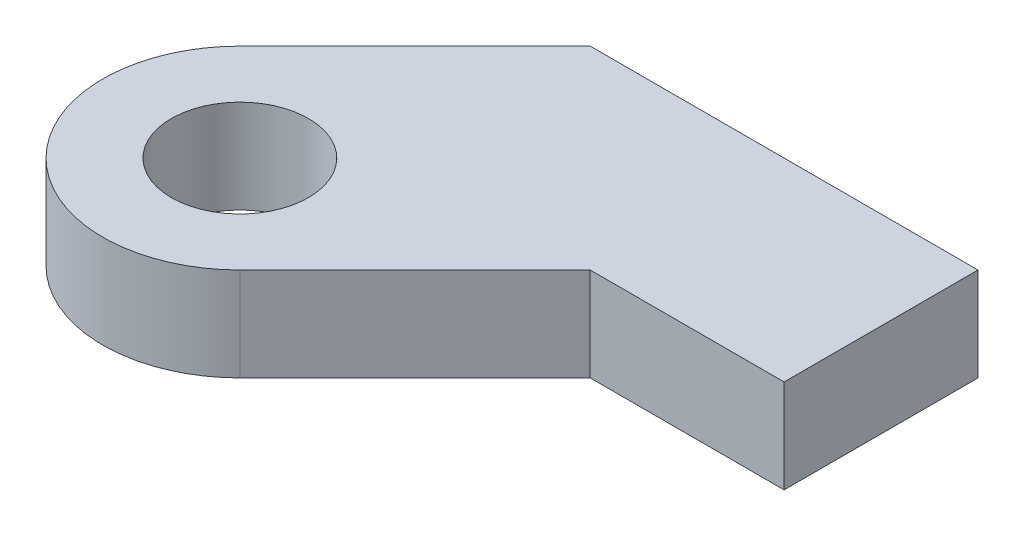
ISO-10303-21;
HEADER;
FILE_DESCRIPTION(('STEP AP214'),'2;1');
FILE_NAME('part.step','',(''),(''),'','','');
FILE_SCHEMA(('AUTOMOTIVE_DESIGN { 1 0 10303 214 1 1 1 1 }'));
ENDSEC;
DATA;
#1=APPLICATION_CONTEXT('core data for automotive mechanical design processes');
#2=APPLICATION_PROTOCOL_DEFINITION('international standard','automotive_design',2000,#1);
#3=PRODUCT_CONTEXT('',#1,'mechanical');
#4=PRODUCT('Part','Part','',(#3));
#5=PRODUCT_RELATED_PRODUCT_CATEGORY('part','',(#4));
#6=PRODUCT_DEFINITION_FORMATION('','',#4);
#7=PRODUCT_DEFINITION_CONTEXT('part definition',#1,'design');
#8=PRODUCT_DEFINITION('design','',#6,#7);
#9=PRODUCT_DEFINITION_SHAPE('','',#8);
#10=(LENGTH_UNIT() NAMED_UNIT(*) SI_UNIT(.MILLI.,.METRE.));
#11=(NAMED_UNIT(*) PLANE_ANGLE_UNIT() SI_UNIT($,.RADIAN.));
#12=(NAMED_UNIT(*) SI_UNIT($,.STERADIAN.) SOLID_ANGLE_UNIT());
#13=UNCERTAINTY_MEASURE_WITH_UNIT(LENGTH_MEASURE(1.E-05),#10,'distance_accuracy_value','');
#14=(GEOMETRIC_REPRESENTATION_CONTEXT(3) GLOBAL_UNCERTAINTY_ASSIGNED_CONTEXT((#13)) GLOBAL_UNIT_ASSIGNED_CONTEXT((#10,
#11,#12)) REPRESENTATION_CONTEXT('',''));
#15=CARTESIAN_POINT('',(0.,0.,0.));
#16=DIRECTION('',(0.,0.,1.));
#17=DIRECTION('',(1.,0.,0.));
#18=AXIS2_PLACEMENT_3D('',#15,#16,#17);
#19=CARTESIAN_POINT('',(-2.82842712474619,1.5,2.82842712474619));
#20=DIRECTION('',(0.,1.,0.));
#21=DIRECTION('',(0.,0.,1.));
#22=AXIS2_PLACEMENT_3D('',#19,#20,#21);
#23=PLANE('',#22);
#24=DIRECTION('',(-1.,0.,0.));
#25=VECTOR('',#24,1.);
#26=CARTESIAN_POINT('',(1.53795724908074,1.5,-1.53795724908074));
#27=LINE('',#26,#25);
#28=CARTESIAN_POINT('',(4.64922708630155,1.5,-1.53795724908074));
#29=VERTEX_POINT('',#28);
#30=CARTESIAN_POINT('',(-1.57331258814007,1.5,-1.53795724908074));
#31=VERTEX_POINT('',#30);
#32=EDGE_CURVE('E51',#29,#31,#27,.T.);
#33=ORIENTED_EDGE('',*,*,#32,.T.);
#34=DIRECTION('',(-0.707106781186547,0.,0.707106781186548));
#35=VECTOR('',#34,1.);
#36=CARTESIAN_POINT('',(-1.57331258814007,1.5,-1.53795724908074));
#37=LINE('',#36,#35);
#38=CARTESIAN_POINT('',(-4.38406204335659,1.5,1.27279220613579));
#39=VERTEX_POINT('',#38);
#40=EDGE_CURVE('E89',#31,#39,#37,.T.);
#41=ORIENTED_EDGE('',*,*,#40,.T.);
#42=CARTESIAN_POINT('',(-2.82842712474619,1.5,2.82842712474619));
#43=DIRECTION('',(0.,1.,0.));
#44=DIRECTION('',(0.,0.,1.));
#45=AXIS2_PLACEMENT_3D('',#42,#43,#44);
#46=CIRCLE('',#45,2.2);
#47=CARTESIAN_POINT('',(-1.27279220613578,1.5,4.3840620433566));
#48=VERTEX_POINT('',#47);
#49=EDGE_CURVE('E103',#39,#48,#46,.T.);
#50=ORIENTED_EDGE('',*,*,#49,.T.);
#51=DIRECTION('',(0.707106781186547,0.,-0.707106781186548));
#52=VECTOR('',#51,1.);
#53=CARTESIAN_POINT('',(1.53795724908074,1.5,1.57331258814007));
#54=LINE('',#53,#52);
#55=CARTESIAN_POINT('',(1.53795724908074,1.5,1.57331258814007));
#56=VERTEX_POINT('',#55);
#57=EDGE_CURVE('E97',#48,#56,#54,.T.);
#58=ORIENTED_EDGE('',*,*,#57,.T.);
#59=DIRECTION('',(1.,0.,0.));
#60=VECTOR('',#59,1.);
#61=CARTESIAN_POINT('',(1.53795724908074,1.5,1.57331258814007));
#62=LINE('',#61,#60);
#63=CARTESIAN_POINT('',(4.64922708630155,1.5,1.57331258814007));
#64=VERTEX_POINT('',#63);
#65=EDGE_CURVE('E101',#56,#64,#62,.T.);
#66=ORIENTED_EDGE('',*,*,#65,.T.);
#67=DIRECTION('',(0.,0.,-1.));
#68=VECTOR('',#67,1.);
#69=CARTESIAN_POINT('',(4.64922708630155,1.5,-1.53795724908074));
#70=LINE('',#69,#68);
#71=EDGE_CURVE('E117',#64,#29,#70,.T.);
#72=ORIENTED_EDGE('',*,*,#71,.T.);
#73=EDGE_LOOP('',(#33,#41,#50,#58,#66,#72));
#74=FACE_BOUND('',#73,.T.);
#75=CARTESIAN_POINT('',(-2.82842712474619,1.5,2.82842712474619));
#76=DIRECTION('',(0.,1.,0.));
#77=DIRECTION('',(0.,0.,1.));
#78=AXIS2_PLACEMENT_3D('',#75,#76,#77);
#79=CIRCLE('',#78,1.1);
#80=CARTESIAN_POINT('',(-2.82842712474619,1.5,3.92842712474619));
#81=VERTEX_POINT('',#80);
#82=EDGE_CURVE('E126',#81,#81,#79,.T.);
#83=ORIENTED_EDGE('',*,*,#82,.F.);
#84=EDGE_LOOP('',(#83));
#85=FACE_BOUND('',#84,.T.);
#86=ADVANCED_FACE('F34',(#74,#85),#23,.T.);
#87=CARTESIAN_POINT('',(-2.82842712474619,0.,2.82842712474619));
#88=DIRECTION('',(0.,1.,0.));
#89=DIRECTION('',(0.,0.,1.));
#90=AXIS2_PLACEMENT_3D('',#87,#88,#89);
#91=PLANE('',#90);
#92=DIRECTION('',(-0.707106781186547,0.,0.707106781186548));
#93=VECTOR('',#92,1.);
#94=CARTESIAN_POINT('',(-1.57331258814007,0.,-1.53795724908074));
#95=LINE('',#94,#93);
#96=CARTESIAN_POINT('',(-1.57331258814007,0.,-1.53795724908074));
#97=VERTEX_POINT('',#96);
#98=CARTESIAN_POINT('',(-4.38406204335659,0.,1.27279220613579));
#99=VERTEX_POINT('',#98);
#100=EDGE_CURVE('E123',#97,#99,#95,.T.);
#101=ORIENTED_EDGE('',*,*,#100,.F.);
#102=DIRECTION('',(-1.,0.,0.));
#103=VECTOR('',#102,1.);
#104=CARTESIAN_POINT('',(1.53795724908074,0.,-1.53795724908074));
#105=LINE('',#104,#103);
#106=CARTESIAN_POINT('',(4.64922708630155,0.,-1.53795724908074));
#107=VERTEX_POINT('',#106);
#108=EDGE_CURVE('E131',#107,#97,#105,.T.);
#109=ORIENTED_EDGE('',*,*,#108,.F.);
#110=DIRECTION('',(0.,0.,-1.));
#111=VECTOR('',#110,1.);
#112=CARTESIAN_POINT('',(4.64922708630155,0.,-1.53795724908074));
#113=LINE('',#112,#111);
#114=CARTESIAN_POINT('',(4.64922708630155,0.,1.57331258814007));
#115=VERTEX_POINT('',#114);
#116=EDGE_CURVE('E82',#115,#107,#113,.T.);
#117=ORIENTED_EDGE('',*,*,#116,.F.);
#118=DIRECTION('',(1.,0.,0.));
#119=VECTOR('',#118,1.);
#120=CARTESIAN_POINT('',(1.53795724908074,0.,1.57331258814007));
#121=LINE('',#120,#119);
#122=CARTESIAN_POINT('',(1.53795724908074,0.,1.57331258814007));
#123=VERTEX_POINT('',#122);
#124=EDGE_CURVE('E75',#123,#115,#121,.T.);
#125=ORIENTED_EDGE('',*,*,#124,.F.);
#126=DIRECTION('',(0.707106781186547,0.,-0.707106781186548));
#127=VECTOR('',#126,1.);
#128=CARTESIAN_POINT('',(1.53795724908074,0.,1.57331258814007));
#129=LINE('',#128,#127);
#130=CARTESIAN_POINT('',(-1.27279220613578,0.,4.3840620433566));
#131=VERTEX_POINT('',#130);
#132=EDGE_CURVE('E111',#131,#123,#129,.T.);
#133=ORIENTED_EDGE('',*,*,#132,.F.);
#134=CARTESIAN_POINT('',(-2.82842712474619,0.,2.82842712474619));
#135=DIRECTION('',(0.,1.,0.));
#136=DIRECTION('',(0.,0.,1.));
#137=AXIS2_PLACEMENT_3D('',#134,#135,#136);
#138=CIRCLE('',#137,2.2);
#139=EDGE_CURVE('E125',#99,#131,#138,.T.);
#140=ORIENTED_EDGE('',*,*,#139,.F.);
#141=EDGE_LOOP('',(#101,#109,#117,#125,#133,#140));
#142=FACE_BOUND('',#141,.T.);
#143=CARTESIAN_POINT('',(-2.82842712474619,0.,2.82842712474619));
#144=DIRECTION('',(0.,1.,0.));
#145=DIRECTION('',(0.,0.,1.));
#146=AXIS2_PLACEMENT_3D('',#143,#144,#145);
#147=CIRCLE('',#146,1.1);
#148=CARTESIAN_POINT('',(-2.82842712474619,0.,3.92842712474619));
#149=VERTEX_POINT('',#148);
#150=EDGE_CURVE('E149',#149,#149,#147,.T.);
#151=ORIENTED_EDGE('',*,*,#150,.T.);
#152=EDGE_LOOP('',(#151));
#153=FACE_BOUND('',#152,.T.);
#154=ADVANCED_FACE('F141',(#142,#153),#91,.F.);
#155=CARTESIAN_POINT('',(-1.57331258814007,1.5,-1.53795724908074));
#156=DIRECTION('',(0.707106781186548,0.,0.707106781186547));
#157=DIRECTION('',(0.707106781186547,0.,-0.707106781186548));
#158=AXIS2_PLACEMENT_3D('',#155,#156,#157);
#159=PLANE('',#158);
#160=ORIENTED_EDGE('',*,*,#100,.T.);
#161=DIRECTION('',(0.,-1.,0.));
#162=VECTOR('',#161,1.);
#163=CARTESIAN_POINT('',(-4.38406204335659,1.5,1.27279220613579));
#164=LINE('',#163,#162);
#165=EDGE_CURVE('E43',#39,#99,#164,.T.);
#166=ORIENTED_EDGE('',*,*,#165,.F.);
#167=ORIENTED_EDGE('',*,*,#40,.F.);
#168=DIRECTION('',(0.,-1.,0.));
#169=VECTOR('',#168,1.);
#170=CARTESIAN_POINT('',(-1.57331258814007,1.5,-1.53795724908074));
#171=LINE('',#170,#169);
#172=EDGE_CURVE('E11',#31,#97,#171,.T.);
#173=ORIENTED_EDGE('',*,*,#172,.T.);
#174=EDGE_LOOP('',(#160,#166,#167,#173));
#175=FACE_BOUND('',#174,.T.);
#176=ADVANCED_FACE('F36',(#175),#159,.F.);
#177=CARTESIAN_POINT('',(-2.82842712474619,1.5,2.82842712474619));
#178=DIRECTION('',(0.,-1.,0.));
#179=DIRECTION('',(0.,0.,-1.));
#180=AXIS2_PLACEMENT_3D('',#177,#178,#179);
#181=CYLINDRICAL_SURFACE('',#180,2.2);
#182=ORIENTED_EDGE('',*,*,#139,.T.);
#183=DIRECTION('',(0.,-1.,0.));
#184=VECTOR('',#183,1.);
#185=CARTESIAN_POINT('',(-1.27279220613578,1.5,4.3840620433566));
#186=LINE('',#185,#184);
#187=EDGE_CURVE('E112',#48,#131,#186,.T.);
#188=ORIENTED_EDGE('',*,*,#187,.F.);
#189=ORIENTED_EDGE('',*,*,#49,.F.);
#190=ORIENTED_EDGE('',*,*,#165,.T.);
#191=EDGE_LOOP('',(#182,#188,#189,#190));
#192=FACE_BOUND('',#191,.T.);
#193=ADVANCED_FACE('F138',(#192),#181,.T.);
#194=CARTESIAN_POINT('',(1.53795724908074,1.5,1.57331258814007));
#195=DIRECTION('',(-0.707106781186548,0.,-0.707106781186547));
#196=DIRECTION('',(-0.707106781186547,0.,0.707106781186548));
#197=AXIS2_PLACEMENT_3D('',#194,#195,#196);
#198=PLANE('',#197);
#199=ORIENTED_EDGE('',*,*,#132,.T.);
#200=DIRECTION('',(0.,-1.,0.));
#201=VECTOR('',#200,1.);
#202=CARTESIAN_POINT('',(1.53795724908074,1.5,1.57331258814007));
#203=LINE('',#202,#201);
#204=EDGE_CURVE('E108',#56,#123,#203,.T.);
#205=ORIENTED_EDGE('',*,*,#204,.F.);
#206=ORIENTED_EDGE('',*,*,#57,.F.);
#207=ORIENTED_EDGE('',*,*,#187,.T.);
#208=EDGE_LOOP('',(#199,#205,#206,#207));
#209=FACE_BOUND('',#208,.T.);
#210=ADVANCED_FACE('F109',(#209),#198,.F.);
#211=CARTESIAN_POINT('',(1.53795724908074,1.5,1.57331258814007));
#212=DIRECTION('',(0.,0.,-1.));
#213=DIRECTION('',(-1.,0.,0.));
#214=AXIS2_PLACEMENT_3D('',#211,#212,#213);
#215=PLANE('',#214);
#216=ORIENTED_EDGE('',*,*,#124,.T.);
#217=DIRECTION('',(0.,-1.,0.));
#218=VECTOR('',#217,1.);
#219=CARTESIAN_POINT('',(4.64922708630155,1.5,1.57331258814007));
#220=LINE('',#219,#218);
#221=EDGE_CURVE('E113',#64,#115,#220,.T.);
#222=ORIENTED_EDGE('',*,*,#221,.F.);
#223=ORIENTED_EDGE('',*,*,#65,.F.);
#224=ORIENTED_EDGE('',*,*,#204,.T.);
#225=EDGE_LOOP('',(#216,#222,#223,#224));
#226=FACE_BOUND('',#225,.T.);
#227=ADVANCED_FACE('F115',(#226),#215,.F.);
#228=CARTESIAN_POINT('',(4.64922708630155,1.5,-1.53795724908074));
#229=DIRECTION('',(-1.,0.,0.));
#230=DIRECTION('',(0.,0.,1.));
#231=AXIS2_PLACEMENT_3D('',#228,#229,#230);
#232=PLANE('',#231);
#233=ORIENTED_EDGE('',*,*,#116,.T.);
#234=DIRECTION('',(0.,-1.,0.));
#235=VECTOR('',#234,1.);
#236=CARTESIAN_POINT('',(4.64922708630155,1.5,-1.53795724908074));
#237=LINE('',#236,#235);
#238=EDGE_CURVE('E119',#29,#107,#237,.T.);
#239=ORIENTED_EDGE('',*,*,#238,.F.);
#240=ORIENTED_EDGE('',*,*,#71,.F.);
#241=ORIENTED_EDGE('',*,*,#221,.T.);
#242=EDGE_LOOP('',(#233,#239,#240,#241));
#243=FACE_BOUND('',#242,.T.);
#244=ADVANCED_FACE('F145',(#243),#232,.F.);
#245=CARTESIAN_POINT('',(1.53795724908074,1.5,-1.53795724908074));
#246=DIRECTION('',(0.,0.,1.));
#247=DIRECTION('',(1.,0.,0.));
#248=AXIS2_PLACEMENT_3D('',#245,#246,#247);
#249=PLANE('',#248);
#250=ORIENTED_EDGE('',*,*,#108,.T.);
#251=ORIENTED_EDGE('',*,*,#172,.F.);
#252=ORIENTED_EDGE('',*,*,#32,.F.);
#253=ORIENTED_EDGE('',*,*,#238,.T.);
#254=EDGE_LOOP('',(#250,#251,#252,#253));
#255=FACE_BOUND('',#254,.T.);
#256=ADVANCED_FACE('F144',(#255),#249,.F.);
#257=CARTESIAN_POINT('',(-2.82842712474619,1.5,2.82842712474619));
#258=DIRECTION('',(0.,-1.,0.));
#259=DIRECTION('',(0.,0.,-1.));
#260=AXIS2_PLACEMENT_3D('',#257,#258,#259);
#261=CYLINDRICAL_SURFACE('',#260,1.1);
#262=ORIENTED_EDGE('',*,*,#82,.T.);
#263=EDGE_LOOP('',(#262));
#264=FACE_BOUND('',#263,.T.);
#265=ORIENTED_EDGE('',*,*,#150,.F.);
#266=EDGE_LOOP('',(#265));
#267=FACE_BOUND('',#266,.T.);
#268=ADVANCED_FACE('F155',(#264,#267),#261,.F.);
#269=CLOSED_SHELL('',(#86,#154,#176,#193,#210,#227,#244,#256,#268));
#270=MANIFOLD_SOLID_BREP('B2',#269);
#271=ADVANCED_BREP_SHAPE_REPRESENTATION('',(#18,#270),#14);
#272=SHAPE_DEFINITION_REPRESENTATION(#9,#271);
ENDSEC;
END-ISO-10303-21;
